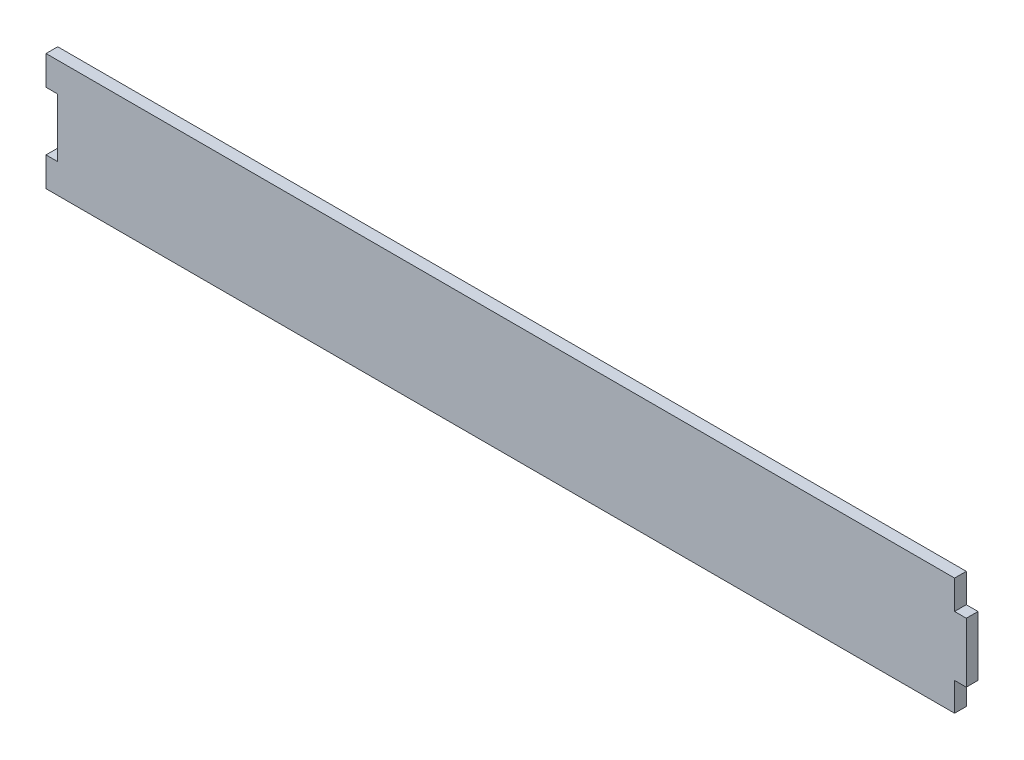
ISO-10303-21;
HEADER;
FILE_DESCRIPTION(('STEP AP214'),'2;1');
FILE_NAME('part.step','',(''),(''),'','','');
FILE_SCHEMA(('AUTOMOTIVE_DESIGN { 1 0 10303 214 1 1 1 1 }'));
ENDSEC;
DATA;
#1=APPLICATION_CONTEXT('core data for automotive mechanical design processes');
#2=APPLICATION_PROTOCOL_DEFINITION('international standard','automotive_design',2000,#1);
#3=PRODUCT_CONTEXT('',#1,'mechanical');
#4=PRODUCT('Part','Part','',(#3));
#5=PRODUCT_RELATED_PRODUCT_CATEGORY('part','',(#4));
#6=PRODUCT_DEFINITION_FORMATION('','',#4);
#7=PRODUCT_DEFINITION_CONTEXT('part definition',#1,'design');
#8=PRODUCT_DEFINITION('design','',#6,#7);
#9=PRODUCT_DEFINITION_SHAPE('','',#8);
#10=(LENGTH_UNIT() NAMED_UNIT(*) SI_UNIT(.MILLI.,.METRE.));
#11=(NAMED_UNIT(*) PLANE_ANGLE_UNIT() SI_UNIT($,.RADIAN.));
#12=(NAMED_UNIT(*) SI_UNIT($,.STERADIAN.) SOLID_ANGLE_UNIT());
#13=UNCERTAINTY_MEASURE_WITH_UNIT(LENGTH_MEASURE(1.E-05),#10,'distance_accuracy_value','');
#14=(GEOMETRIC_REPRESENTATION_CONTEXT(3) GLOBAL_UNCERTAINTY_ASSIGNED_CONTEXT((#13)) GLOBAL_UNIT_ASSIGNED_CONTEXT((#10,
#11,#12)) REPRESENTATION_CONTEXT('',''));
#15=CARTESIAN_POINT('',(0.,0.,0.));
#16=DIRECTION('',(0.,0.,1.));
#17=DIRECTION('',(1.,0.,0.));
#18=AXIS2_PLACEMENT_3D('',#15,#16,#17);
#19=CARTESIAN_POINT('',(0.,0.,5.));
#20=DIRECTION('',(-1.,0.,0.));
#21=DIRECTION('',(0.,0.,1.));
#22=AXIS2_PLACEMENT_3D('',#19,#20,#21);
#23=PLANE('',#22);
#24=DIRECTION('',(0.,0.,-1.));
#25=VECTOR('',#24,1.);
#26=CARTESIAN_POINT('',(0.,37.5,5.));
#27=LINE('',#26,#25);
#28=CARTESIAN_POINT('',(0.,37.5,5.));
#29=VERTEX_POINT('',#28);
#30=CARTESIAN_POINT('',(0.,37.5,0.));
#31=VERTEX_POINT('',#30);
#32=EDGE_CURVE('E186',#29,#31,#27,.T.);
#33=ORIENTED_EDGE('',*,*,#32,.F.);
#34=DIRECTION('',(0.,1.,0.));
#35=VECTOR('',#34,1.);
#36=CARTESIAN_POINT('',(0.,0.,5.));
#37=LINE('',#36,#35);
#38=CARTESIAN_POINT('',(0.,50.,5.));
#39=VERTEX_POINT('',#38);
#40=EDGE_CURVE('E193',#29,#39,#37,.T.);
#41=ORIENTED_EDGE('',*,*,#40,.T.);
#42=DIRECTION('',(0.,0.,-1.));
#43=VECTOR('',#42,1.);
#44=CARTESIAN_POINT('',(0.,50.,5.));
#45=LINE('',#44,#43);
#46=CARTESIAN_POINT('',(0.,50.,0.));
#47=VERTEX_POINT('',#46);
#48=EDGE_CURVE('E199',#39,#47,#45,.T.);
#49=ORIENTED_EDGE('',*,*,#48,.T.);
#50=DIRECTION('',(0.,1.,0.));
#51=VECTOR('',#50,1.);
#52=CARTESIAN_POINT('',(0.,0.,0.));
#53=LINE('',#52,#51);
#54=EDGE_CURVE('E188',#31,#47,#53,.T.);
#55=ORIENTED_EDGE('',*,*,#54,.F.);
#56=EDGE_LOOP('',(#33,#41,#49,#55));
#57=FACE_BOUND('',#56,.T.);
#58=ADVANCED_FACE('F37',(#57),#23,.T.);
#59=DIRECTION('',(0.,0.,1.));
#60=VECTOR('',#59,1.);
#61=CARTESIAN_POINT('',(0.,12.5,5.));
#62=LINE('',#61,#60);
#63=CARTESIAN_POINT('',(0.,12.5,0.));
#64=VERTEX_POINT('',#63);
#65=CARTESIAN_POINT('',(0.,12.5,5.));
#66=VERTEX_POINT('',#65);
#67=EDGE_CURVE('E182',#64,#66,#62,.T.);
#68=ORIENTED_EDGE('',*,*,#67,.F.);
#69=CARTESIAN_POINT('',(0.,0.,0.));
#70=VERTEX_POINT('',#69);
#71=EDGE_CURVE('E200',#70,#64,#53,.T.);
#72=ORIENTED_EDGE('',*,*,#71,.F.);
#73=DIRECTION('',(0.,0.,-1.));
#74=VECTOR('',#73,1.);
#75=CARTESIAN_POINT('',(0.,0.,5.));
#76=LINE('',#75,#74);
#77=CARTESIAN_POINT('',(0.,0.,5.));
#78=VERTEX_POINT('',#77);
#79=EDGE_CURVE('E210',#78,#70,#76,.T.);
#80=ORIENTED_EDGE('',*,*,#79,.F.);
#81=EDGE_CURVE('E189',#78,#66,#37,.T.);
#82=ORIENTED_EDGE('',*,*,#81,.T.);
#83=EDGE_LOOP('',(#68,#72,#80,#82));
#84=FACE_BOUND('',#83,.T.);
#85=ADVANCED_FACE('F39',(#84),#23,.T.);
#86=CARTESIAN_POINT('',(0.,0.,5.));
#87=DIRECTION('',(0.,1.,0.));
#88=DIRECTION('',(0.,0.,1.));
#89=AXIS2_PLACEMENT_3D('',#86,#87,#88);
#90=PLANE('',#89);
#91=DIRECTION('',(1.,0.,0.));
#92=VECTOR('',#91,1.);
#93=CARTESIAN_POINT('',(0.,0.,0.));
#94=LINE('',#93,#92);
#95=CARTESIAN_POINT('',(388.,0.,0.));
#96=VERTEX_POINT('',#95);
#97=EDGE_CURVE('E207',#70,#96,#94,.T.);
#98=ORIENTED_EDGE('',*,*,#97,.T.);
#99=DIRECTION('',(0.,0.,1.));
#100=VECTOR('',#99,1.);
#101=CARTESIAN_POINT('',(388.,0.,5.));
#102=LINE('',#101,#100);
#103=CARTESIAN_POINT('',(388.,0.,5.));
#104=VERTEX_POINT('',#103);
#105=EDGE_CURVE('E149',#96,#104,#102,.T.);
#106=ORIENTED_EDGE('',*,*,#105,.T.);
#107=DIRECTION('',(1.,0.,0.));
#108=VECTOR('',#107,1.);
#109=CARTESIAN_POINT('',(0.,0.,5.));
#110=LINE('',#109,#108);
#111=EDGE_CURVE('E144',#78,#104,#110,.T.);
#112=ORIENTED_EDGE('',*,*,#111,.F.);
#113=ORIENTED_EDGE('',*,*,#79,.T.);
#114=EDGE_LOOP('',(#98,#106,#112,#113));
#115=FACE_BOUND('',#114,.T.);
#116=ADVANCED_FACE('F240',(#115),#90,.F.);
#117=CARTESIAN_POINT('',(393.,0.,5.));
#118=DIRECTION('',(-1.,0.,0.));
#119=DIRECTION('',(0.,0.,1.));
#120=AXIS2_PLACEMENT_3D('',#117,#118,#119);
#121=PLANE('',#120);
#122=DIRECTION('',(0.,1.,0.));
#123=VECTOR('',#122,1.);
#124=CARTESIAN_POINT('',(393.,0.,5.));
#125=LINE('',#124,#123);
#126=CARTESIAN_POINT('',(393.,12.15,5.));
#127=VERTEX_POINT('',#126);
#128=CARTESIAN_POINT('',(393.,37.65,5.));
#129=VERTEX_POINT('',#128);
#130=EDGE_CURVE('E196',#127,#129,#125,.T.);
#131=ORIENTED_EDGE('',*,*,#130,.F.);
#132=DIRECTION('',(0.,0.,-1.));
#133=VECTOR('',#132,1.);
#134=CARTESIAN_POINT('',(393.,12.15,5.));
#135=LINE('',#134,#133);
#136=CARTESIAN_POINT('',(393.,12.15,0.));
#137=VERTEX_POINT('',#136);
#138=EDGE_CURVE('E131',#127,#137,#135,.T.);
#139=ORIENTED_EDGE('',*,*,#138,.T.);
#140=DIRECTION('',(0.,1.,0.));
#141=VECTOR('',#140,1.);
#142=CARTESIAN_POINT('',(393.,0.,0.));
#143=LINE('',#142,#141);
#144=CARTESIAN_POINT('',(393.,37.65,0.));
#145=VERTEX_POINT('',#144);
#146=EDGE_CURVE('E60',#137,#145,#143,.T.);
#147=ORIENTED_EDGE('',*,*,#146,.T.);
#148=DIRECTION('',(0.,0.,1.));
#149=VECTOR('',#148,1.);
#150=CARTESIAN_POINT('',(393.,37.65,5.));
#151=LINE('',#150,#149);
#152=EDGE_CURVE('E162',#145,#129,#151,.T.);
#153=ORIENTED_EDGE('',*,*,#152,.T.);
#154=EDGE_LOOP('',(#131,#139,#147,#153));
#155=FACE_BOUND('',#154,.T.);
#156=ADVANCED_FACE('F238',(#155),#121,.F.);
#157=CARTESIAN_POINT('',(0.,50.,5.));
#158=DIRECTION('',(0.,1.,0.));
#159=DIRECTION('',(0.,0.,1.));
#160=AXIS2_PLACEMENT_3D('',#157,#158,#159);
#161=PLANE('',#160);
#162=DIRECTION('',(0.,0.,1.));
#163=VECTOR('',#162,1.);
#164=CARTESIAN_POINT('',(388.,50.,5.));
#165=LINE('',#164,#163);
#166=CARTESIAN_POINT('',(388.,50.,0.));
#167=VERTEX_POINT('',#166);
#168=CARTESIAN_POINT('',(388.,50.,5.));
#169=VERTEX_POINT('',#168);
#170=EDGE_CURVE('E164',#167,#169,#165,.T.);
#171=ORIENTED_EDGE('',*,*,#170,.F.);
#172=DIRECTION('',(1.,0.,0.));
#173=VECTOR('',#172,1.);
#174=CARTESIAN_POINT('',(0.,50.,0.));
#175=LINE('',#174,#173);
#176=EDGE_CURVE('E203',#47,#167,#175,.T.);
#177=ORIENTED_EDGE('',*,*,#176,.F.);
#178=ORIENTED_EDGE('',*,*,#48,.F.);
#179=DIRECTION('',(1.,0.,0.));
#180=VECTOR('',#179,1.);
#181=CARTESIAN_POINT('',(0.,50.,5.));
#182=LINE('',#181,#180);
#183=EDGE_CURVE('E192',#39,#169,#182,.T.);
#184=ORIENTED_EDGE('',*,*,#183,.T.);
#185=EDGE_LOOP('',(#171,#177,#178,#184));
#186=FACE_BOUND('',#185,.T.);
#187=ADVANCED_FACE('F224',(#186),#161,.T.);
#188=CARTESIAN_POINT('',(0.,0.,5.));
#189=DIRECTION('',(0.,0.,-1.));
#190=DIRECTION('',(-1.,0.,0.));
#191=AXIS2_PLACEMENT_3D('',#188,#189,#190);
#192=PLANE('',#191);
#193=ORIENTED_EDGE('',*,*,#111,.T.);
#194=DIRECTION('',(0.,-1.,0.));
#195=VECTOR('',#194,1.);
#196=CARTESIAN_POINT('',(388.,12.15,5.));
#197=LINE('',#196,#195);
#198=CARTESIAN_POINT('',(388.,12.15,5.));
#199=VERTEX_POINT('',#198);
#200=EDGE_CURVE('E135',#199,#104,#197,.T.);
#201=ORIENTED_EDGE('',*,*,#200,.F.);
#202=DIRECTION('',(-1.,0.,0.));
#203=VECTOR('',#202,1.);
#204=CARTESIAN_POINT('',(388.,12.15,5.));
#205=LINE('',#204,#203);
#206=EDGE_CURVE('E127',#127,#199,#205,.T.);
#207=ORIENTED_EDGE('',*,*,#206,.F.);
#208=ORIENTED_EDGE('',*,*,#130,.T.);
#209=DIRECTION('',(1.,0.,0.));
#210=VECTOR('',#209,1.);
#211=CARTESIAN_POINT('',(388.,37.65,5.));
#212=LINE('',#211,#210);
#213=CARTESIAN_POINT('',(388.,37.65,5.));
#214=VERTEX_POINT('',#213);
#215=EDGE_CURVE('E156',#214,#129,#212,.T.);
#216=ORIENTED_EDGE('',*,*,#215,.F.);
#217=DIRECTION('',(0.,-1.,0.));
#218=VECTOR('',#217,1.);
#219=CARTESIAN_POINT('',(388.,60.7982044830044,5.));
#220=LINE('',#219,#218);
#221=EDGE_CURVE('E151',#169,#214,#220,.T.);
#222=ORIENTED_EDGE('',*,*,#221,.F.);
#223=ORIENTED_EDGE('',*,*,#183,.F.);
#224=ORIENTED_EDGE('',*,*,#40,.F.);
#225=DIRECTION('',(-1.,0.,0.));
#226=VECTOR('',#225,1.);
#227=CARTESIAN_POINT('',(-15.1751637740127,37.5,5.));
#228=LINE('',#227,#226);
#229=CARTESIAN_POINT('',(5.,37.5,5.));
#230=VERTEX_POINT('',#229);
#231=EDGE_CURVE('E171',#230,#29,#228,.T.);
#232=ORIENTED_EDGE('',*,*,#231,.F.);
#233=DIRECTION('',(0.,1.,0.));
#234=VECTOR('',#233,1.);
#235=CARTESIAN_POINT('',(5.,37.5,5.));
#236=LINE('',#235,#234);
#237=CARTESIAN_POINT('',(5.,12.5,5.));
#238=VERTEX_POINT('',#237);
#239=EDGE_CURVE('E176',#238,#230,#236,.T.);
#240=ORIENTED_EDGE('',*,*,#239,.F.);
#241=DIRECTION('',(1.,0.,0.));
#242=VECTOR('',#241,1.);
#243=CARTESIAN_POINT('',(-15.1751637740127,12.5,5.));
#244=LINE('',#243,#242);
#245=EDGE_CURVE('E166',#66,#238,#244,.T.);
#246=ORIENTED_EDGE('',*,*,#245,.F.);
#247=ORIENTED_EDGE('',*,*,#81,.F.);
#248=EDGE_LOOP('',(#193,#201,#207,#208,#216,#222,#223,#224,#232,#240,#246,#247));
#249=FACE_BOUND('',#248,.T.);
#250=ADVANCED_FACE('F141',(#249),#192,.F.);
#251=CARTESIAN_POINT('',(0.,0.,0.));
#252=DIRECTION('',(0.,0.,-1.));
#253=DIRECTION('',(-1.,0.,0.));
#254=AXIS2_PLACEMENT_3D('',#251,#252,#253);
#255=PLANE('',#254);
#256=DIRECTION('',(0.,-1.,0.));
#257=VECTOR('',#256,1.);
#258=CARTESIAN_POINT('',(388.,12.15,0.));
#259=LINE('',#258,#257);
#260=CARTESIAN_POINT('',(388.,12.15,0.));
#261=VERTEX_POINT('',#260);
#262=EDGE_CURVE('E52',#261,#96,#259,.T.);
#263=ORIENTED_EDGE('',*,*,#262,.T.);
#264=ORIENTED_EDGE('',*,*,#97,.F.);
#265=ORIENTED_EDGE('',*,*,#71,.T.);
#266=DIRECTION('',(-1.,0.,0.));
#267=VECTOR('',#266,1.);
#268=CARTESIAN_POINT('',(0.,12.5,0.));
#269=LINE('',#268,#267);
#270=CARTESIAN_POINT('',(5.,12.5,0.));
#271=VERTEX_POINT('',#270);
#272=EDGE_CURVE('E212',#271,#64,#269,.T.);
#273=ORIENTED_EDGE('',*,*,#272,.F.);
#274=DIRECTION('',(0.,1.,0.));
#275=VECTOR('',#274,1.);
#276=CARTESIAN_POINT('',(5.,37.5,0.));
#277=LINE('',#276,#275);
#278=CARTESIAN_POINT('',(5.,37.5,0.));
#279=VERTEX_POINT('',#278);
#280=EDGE_CURVE('E167',#271,#279,#277,.T.);
#281=ORIENTED_EDGE('',*,*,#280,.T.);
#282=DIRECTION('',(-1.,0.,0.));
#283=VECTOR('',#282,1.);
#284=CARTESIAN_POINT('',(-15.1751637740127,37.5,0.));
#285=LINE('',#284,#283);
#286=EDGE_CURVE('E170',#279,#31,#285,.T.);
#287=ORIENTED_EDGE('',*,*,#286,.T.);
#288=ORIENTED_EDGE('',*,*,#54,.T.);
#289=ORIENTED_EDGE('',*,*,#176,.T.);
#290=DIRECTION('',(0.,1.,0.));
#291=VECTOR('',#290,1.);
#292=CARTESIAN_POINT('',(388.,0.,0.));
#293=LINE('',#292,#291);
#294=CARTESIAN_POINT('',(388.,37.65,0.));
#295=VERTEX_POINT('',#294);
#296=EDGE_CURVE('E45',#295,#167,#293,.T.);
#297=ORIENTED_EDGE('',*,*,#296,.F.);
#298=DIRECTION('',(1.,0.,0.));
#299=VECTOR('',#298,1.);
#300=CARTESIAN_POINT('',(388.,37.65,0.));
#301=LINE('',#300,#299);
#302=EDGE_CURVE('E152',#295,#145,#301,.T.);
#303=ORIENTED_EDGE('',*,*,#302,.T.);
#304=ORIENTED_EDGE('',*,*,#146,.F.);
#305=DIRECTION('',(1.,0.,0.));
#306=VECTOR('',#305,1.);
#307=CARTESIAN_POINT('',(0.,12.15,0.));
#308=LINE('',#307,#306);
#309=EDGE_CURVE('E11',#261,#137,#308,.T.);
#310=ORIENTED_EDGE('',*,*,#309,.F.);
#311=EDGE_LOOP('',(#263,#264,#265,#273,#281,#287,#288,#289,#297,#303,#304,#310));
#312=FACE_BOUND('',#311,.T.);
#313=ADVANCED_FACE('F227',(#312),#255,.T.);
#314=CARTESIAN_POINT('',(-15.1751637740127,37.5,0.));
#315=DIRECTION('',(0.,1.,0.));
#316=DIRECTION('',(0.,0.,1.));
#317=AXIS2_PLACEMENT_3D('',#314,#315,#316);
#318=PLANE('',#317);
#319=ORIENTED_EDGE('',*,*,#32,.T.);
#320=ORIENTED_EDGE('',*,*,#286,.F.);
#321=DIRECTION('',(0.,0.,1.));
#322=VECTOR('',#321,1.);
#323=CARTESIAN_POINT('',(5.,37.5,0.));
#324=LINE('',#323,#322);
#325=EDGE_CURVE('E180',#279,#230,#324,.T.);
#326=ORIENTED_EDGE('',*,*,#325,.T.);
#327=ORIENTED_EDGE('',*,*,#231,.T.);
#328=EDGE_LOOP('',(#319,#320,#326,#327));
#329=FACE_BOUND('',#328,.T.);
#330=ADVANCED_FACE('F266',(#329),#318,.F.);
#331=CARTESIAN_POINT('',(5.,37.5,0.));
#332=DIRECTION('',(1.,0.,0.));
#333=DIRECTION('',(0.,1.,0.));
#334=AXIS2_PLACEMENT_3D('',#331,#332,#333);
#335=PLANE('',#334);
#336=ORIENTED_EDGE('',*,*,#239,.T.);
#337=ORIENTED_EDGE('',*,*,#325,.F.);
#338=ORIENTED_EDGE('',*,*,#280,.F.);
#339=DIRECTION('',(0.,0.,1.));
#340=VECTOR('',#339,1.);
#341=CARTESIAN_POINT('',(5.,12.5,0.));
#342=LINE('',#341,#340);
#343=EDGE_CURVE('E174',#271,#238,#342,.T.);
#344=ORIENTED_EDGE('',*,*,#343,.T.);
#345=EDGE_LOOP('',(#336,#337,#338,#344));
#346=FACE_BOUND('',#345,.T.);
#347=ADVANCED_FACE('F264',(#346),#335,.F.);
#348=CARTESIAN_POINT('',(-15.1751637740127,12.5,0.));
#349=DIRECTION('',(0.,-1.,0.));
#350=DIRECTION('',(0.,0.,-1.));
#351=AXIS2_PLACEMENT_3D('',#348,#349,#350);
#352=PLANE('',#351);
#353=ORIENTED_EDGE('',*,*,#67,.T.);
#354=ORIENTED_EDGE('',*,*,#245,.T.);
#355=ORIENTED_EDGE('',*,*,#343,.F.);
#356=ORIENTED_EDGE('',*,*,#272,.T.);
#357=EDGE_LOOP('',(#353,#354,#355,#356));
#358=FACE_BOUND('',#357,.T.);
#359=ADVANCED_FACE('F262',(#358),#352,.F.);
#360=CARTESIAN_POINT('',(388.,37.65,0.));
#361=DIRECTION('',(0.,-1.,0.));
#362=DIRECTION('',(0.,0.,-1.));
#363=AXIS2_PLACEMENT_3D('',#360,#361,#362);
#364=PLANE('',#363);
#365=ORIENTED_EDGE('',*,*,#302,.F.);
#366=DIRECTION('',(0.,0.,1.));
#367=VECTOR('',#366,1.);
#368=CARTESIAN_POINT('',(388.,37.65,0.));
#369=LINE('',#368,#367);
#370=EDGE_CURVE('E155',#295,#214,#369,.T.);
#371=ORIENTED_EDGE('',*,*,#370,.T.);
#372=ORIENTED_EDGE('',*,*,#215,.T.);
#373=ORIENTED_EDGE('',*,*,#152,.F.);
#374=EDGE_LOOP('',(#365,#371,#372,#373));
#375=FACE_BOUND('',#374,.T.);
#376=ADVANCED_FACE('F236',(#375),#364,.F.);
#377=CARTESIAN_POINT('',(388.,60.7982044830044,0.));
#378=DIRECTION('',(-1.,0.,0.));
#379=DIRECTION('',(0.,0.,1.));
#380=AXIS2_PLACEMENT_3D('',#377,#378,#379);
#381=PLANE('',#380);
#382=ORIENTED_EDGE('',*,*,#170,.T.);
#383=ORIENTED_EDGE('',*,*,#221,.T.);
#384=ORIENTED_EDGE('',*,*,#370,.F.);
#385=ORIENTED_EDGE('',*,*,#296,.T.);
#386=EDGE_LOOP('',(#382,#383,#384,#385));
#387=FACE_BOUND('',#386,.T.);
#388=ADVANCED_FACE('F218',(#387),#381,.F.);
#389=CARTESIAN_POINT('',(388.,12.15,0.));
#390=DIRECTION('',(-1.,0.,0.));
#391=DIRECTION('',(0.,0.,1.));
#392=AXIS2_PLACEMENT_3D('',#389,#390,#391);
#393=PLANE('',#392);
#394=ORIENTED_EDGE('',*,*,#262,.F.);
#395=DIRECTION('',(0.,0.,1.));
#396=VECTOR('',#395,1.);
#397=CARTESIAN_POINT('',(388.,12.15,0.));
#398=LINE('',#397,#396);
#399=EDGE_CURVE('E129',#261,#199,#398,.T.);
#400=ORIENTED_EDGE('',*,*,#399,.T.);
#401=ORIENTED_EDGE('',*,*,#200,.T.);
#402=ORIENTED_EDGE('',*,*,#105,.F.);
#403=EDGE_LOOP('',(#394,#400,#401,#402));
#404=FACE_BOUND('',#403,.T.);
#405=ADVANCED_FACE('F137',(#404),#393,.F.);
#406=CARTESIAN_POINT('',(388.,12.15,0.));
#407=DIRECTION('',(0.,1.,0.));
#408=DIRECTION('',(0.,0.,1.));
#409=AXIS2_PLACEMENT_3D('',#406,#407,#408);
#410=PLANE('',#409);
#411=ORIENTED_EDGE('',*,*,#206,.T.);
#412=ORIENTED_EDGE('',*,*,#399,.F.);
#413=ORIENTED_EDGE('',*,*,#309,.T.);
#414=ORIENTED_EDGE('',*,*,#138,.F.);
#415=EDGE_LOOP('',(#411,#412,#413,#414));
#416=FACE_BOUND('',#415,.T.);
#417=ADVANCED_FACE('F128',(#416),#410,.F.);
#418=CLOSED_SHELL('',(#58,#85,#116,#156,#187,#250,#313,#330,#347,#359,#376,#388,#405,#417));
#419=MANIFOLD_SOLID_BREP('B2',#418);
#420=ADVANCED_BREP_SHAPE_REPRESENTATION('',(#18,#419),#14);
#421=SHAPE_DEFINITION_REPRESENTATION(#9,#420);
ENDSEC;
END-ISO-10303-21;
